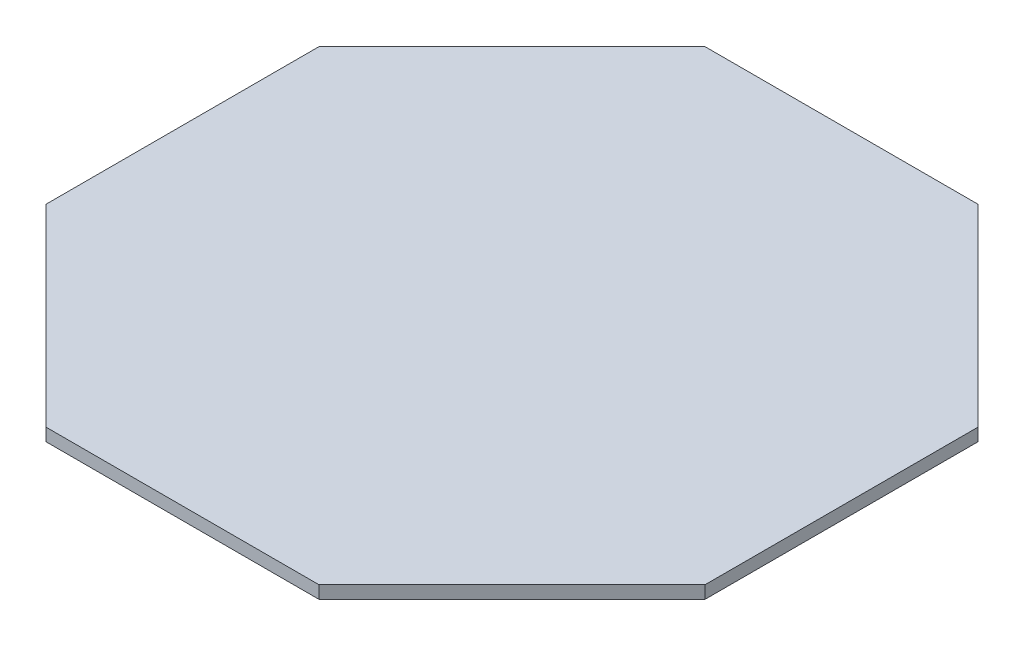
ISO-10303-21;
HEADER;
FILE_DESCRIPTION(('STEP AP214'),'2;1');
FILE_NAME('part.step','',(''),(''),'','','');
FILE_SCHEMA(('AUTOMOTIVE_DESIGN { 1 0 10303 214 1 1 1 1 }'));
ENDSEC;
DATA;
#1=APPLICATION_CONTEXT('core data for automotive mechanical design processes');
#2=APPLICATION_PROTOCOL_DEFINITION('international standard','automotive_design',2000,#1);
#3=PRODUCT_CONTEXT('',#1,'mechanical');
#4=PRODUCT('Part','Part','',(#3));
#5=PRODUCT_RELATED_PRODUCT_CATEGORY('part','',(#4));
#6=PRODUCT_DEFINITION_FORMATION('','',#4);
#7=PRODUCT_DEFINITION_CONTEXT('part definition',#1,'design');
#8=PRODUCT_DEFINITION('design','',#6,#7);
#9=PRODUCT_DEFINITION_SHAPE('','',#8);
#10=(LENGTH_UNIT() NAMED_UNIT(*) SI_UNIT(.MILLI.,.METRE.));
#11=(NAMED_UNIT(*) PLANE_ANGLE_UNIT() SI_UNIT($,.RADIAN.));
#12=(NAMED_UNIT(*) SI_UNIT($,.STERADIAN.) SOLID_ANGLE_UNIT());
#13=UNCERTAINTY_MEASURE_WITH_UNIT(LENGTH_MEASURE(1.E-05),#10,'distance_accuracy_value','');
#14=(GEOMETRIC_REPRESENTATION_CONTEXT(3) GLOBAL_UNCERTAINTY_ASSIGNED_CONTEXT((#13)) GLOBAL_UNIT_ASSIGNED_CONTEXT((#10,
#11,#12)) REPRESENTATION_CONTEXT('',''));
#15=CARTESIAN_POINT('',(0.,0.,0.));
#16=DIRECTION('',(0.,0.,1.));
#17=DIRECTION('',(1.,0.,0.));
#18=AXIS2_PLACEMENT_3D('',#15,#16,#17);
#19=CARTESIAN_POINT('',(78.0000000000003,-3.,32.3086578651015));
#20=DIRECTION('',(1.,0.,0.));
#21=DIRECTION('',(0.,0.,-1.));
#22=AXIS2_PLACEMENT_3D('',#19,#20,#21);
#23=PLANE('',#22);
#24=DIRECTION('',(0.,0.,-1.));
#25=VECTOR('',#24,1.);
#26=CARTESIAN_POINT('',(78.0000000000003,0.,32.3086578651015));
#27=LINE('',#26,#25);
#28=CARTESIAN_POINT('',(78.0000000000003,0.,32.3086578651015));
#29=VERTEX_POINT('',#28);
#30=CARTESIAN_POINT('',(78.0000000000003,0.,-32.3086578651015));
#31=VERTEX_POINT('',#30);
#32=EDGE_CURVE('E129',#29,#31,#27,.T.);
#33=ORIENTED_EDGE('',*,*,#32,.F.);
#34=DIRECTION('',(0.,1.,0.));
#35=VECTOR('',#34,1.);
#36=CARTESIAN_POINT('',(78.0000000000003,-3.,32.3086578651015));
#37=LINE('',#36,#35);
#38=CARTESIAN_POINT('',(78.0000000000003,-3.,32.3086578651015));
#39=VERTEX_POINT('',#38);
#40=EDGE_CURVE('E11',#39,#29,#37,.T.);
#41=ORIENTED_EDGE('',*,*,#40,.F.);
#42=DIRECTION('',(0.,0.,-1.));
#43=VECTOR('',#42,1.);
#44=CARTESIAN_POINT('',(78.0000000000003,-3.,32.3086578651015));
#45=LINE('',#44,#43);
#46=CARTESIAN_POINT('',(78.0000000000003,-3.,-32.3086578651015));
#47=VERTEX_POINT('',#46);
#48=EDGE_CURVE('E149',#39,#47,#45,.T.);
#49=ORIENTED_EDGE('',*,*,#48,.T.);
#50=DIRECTION('',(0.,1.,0.));
#51=VECTOR('',#50,1.);
#52=CARTESIAN_POINT('',(78.0000000000003,-3.,-32.3086578651015));
#53=LINE('',#52,#51);
#54=EDGE_CURVE('E35',#47,#31,#53,.T.);
#55=ORIENTED_EDGE('',*,*,#54,.T.);
#56=EDGE_LOOP('',(#33,#41,#49,#55));
#57=FACE_BOUND('',#56,.T.);
#58=ADVANCED_FACE('F32',(#57),#23,.T.);
#59=CARTESIAN_POINT('',(32.3086578651015,-3.,78.0000000000003));
#60=DIRECTION('',(0.707106781186547,0.,0.707106781186547));
#61=DIRECTION('',(0.707106781186548,0.,-0.707106781186548));
#62=AXIS2_PLACEMENT_3D('',#59,#60,#61);
#63=PLANE('',#62);
#64=DIRECTION('',(0.707106781186548,0.,-0.707106781186548));
#65=VECTOR('',#64,1.);
#66=CARTESIAN_POINT('',(32.3086578651015,0.,78.0000000000003));
#67=LINE('',#66,#65);
#68=CARTESIAN_POINT('',(32.3086578651015,0.,78.0000000000003));
#69=VERTEX_POINT('',#68);
#70=EDGE_CURVE('E147',#69,#29,#67,.T.);
#71=ORIENTED_EDGE('',*,*,#70,.F.);
#72=DIRECTION('',(0.,1.,0.));
#73=VECTOR('',#72,1.);
#74=CARTESIAN_POINT('',(32.3086578651015,-3.,78.0000000000003));
#75=LINE('',#74,#73);
#76=CARTESIAN_POINT('',(32.3086578651015,-3.,78.0000000000003));
#77=VERTEX_POINT('',#76);
#78=EDGE_CURVE('E41',#77,#69,#75,.T.);
#79=ORIENTED_EDGE('',*,*,#78,.F.);
#80=DIRECTION('',(0.707106781186548,0.,-0.707106781186548));
#81=VECTOR('',#80,1.);
#82=CARTESIAN_POINT('',(32.3086578651015,-3.,78.0000000000003));
#83=LINE('',#82,#81);
#84=EDGE_CURVE('E119',#77,#39,#83,.T.);
#85=ORIENTED_EDGE('',*,*,#84,.T.);
#86=ORIENTED_EDGE('',*,*,#40,.T.);
#87=EDGE_LOOP('',(#71,#79,#85,#86));
#88=FACE_BOUND('',#87,.T.);
#89=ADVANCED_FACE('F161',(#88),#63,.T.);
#90=CARTESIAN_POINT('',(-32.3086578651015,-3.,78.0000000000003));
#91=DIRECTION('',(0.,0.,1.));
#92=DIRECTION('',(1.,0.,0.));
#93=AXIS2_PLACEMENT_3D('',#90,#91,#92);
#94=PLANE('',#93);
#95=DIRECTION('',(1.,0.,0.));
#96=VECTOR('',#95,1.);
#97=CARTESIAN_POINT('',(-32.3086578651015,0.,78.0000000000003));
#98=LINE('',#97,#96);
#99=CARTESIAN_POINT('',(-32.3086578651015,0.,78.0000000000003));
#100=VERTEX_POINT('',#99);
#101=EDGE_CURVE('E106',#100,#69,#98,.T.);
#102=ORIENTED_EDGE('',*,*,#101,.F.);
#103=DIRECTION('',(0.,1.,0.));
#104=VECTOR('',#103,1.);
#105=CARTESIAN_POINT('',(-32.3086578651015,-3.,78.0000000000003));
#106=LINE('',#105,#104);
#107=CARTESIAN_POINT('',(-32.3086578651015,-3.,78.0000000000003));
#108=VERTEX_POINT('',#107);
#109=EDGE_CURVE('E101',#108,#100,#106,.T.);
#110=ORIENTED_EDGE('',*,*,#109,.F.);
#111=DIRECTION('',(1.,0.,0.));
#112=VECTOR('',#111,1.);
#113=CARTESIAN_POINT('',(-32.3086578651015,-3.,78.0000000000003));
#114=LINE('',#113,#112);
#115=EDGE_CURVE('E104',#108,#77,#114,.T.);
#116=ORIENTED_EDGE('',*,*,#115,.T.);
#117=ORIENTED_EDGE('',*,*,#78,.T.);
#118=EDGE_LOOP('',(#102,#110,#116,#117));
#119=FACE_BOUND('',#118,.T.);
#120=ADVANCED_FACE('F103',(#119),#94,.T.);
#121=CARTESIAN_POINT('',(-78.0000000000003,-3.,32.3086578651015));
#122=DIRECTION('',(-0.707106781186547,0.,0.707106781186548));
#123=DIRECTION('',(0.707106781186548,0.,0.707106781186547));
#124=AXIS2_PLACEMENT_3D('',#121,#122,#123);
#125=PLANE('',#124);
#126=DIRECTION('',(0.707106781186548,0.,0.707106781186548));
#127=VECTOR('',#126,1.);
#128=CARTESIAN_POINT('',(-78.0000000000003,0.,32.3086578651015));
#129=LINE('',#128,#127);
#130=CARTESIAN_POINT('',(-78.0000000000003,0.,32.3086578651015));
#131=VERTEX_POINT('',#130);
#132=EDGE_CURVE('E144',#131,#100,#129,.T.);
#133=ORIENTED_EDGE('',*,*,#132,.F.);
#134=DIRECTION('',(0.,1.,0.));
#135=VECTOR('',#134,1.);
#136=CARTESIAN_POINT('',(-78.0000000000003,-3.,32.3086578651015));
#137=LINE('',#136,#135);
#138=CARTESIAN_POINT('',(-78.0000000000003,-3.,32.3086578651015));
#139=VERTEX_POINT('',#138);
#140=EDGE_CURVE('E111',#139,#131,#137,.T.);
#141=ORIENTED_EDGE('',*,*,#140,.F.);
#142=DIRECTION('',(0.707106781186548,0.,0.707106781186548));
#143=VECTOR('',#142,1.);
#144=CARTESIAN_POINT('',(-78.0000000000003,-3.,32.3086578651015));
#145=LINE('',#144,#143);
#146=EDGE_CURVE('E117',#139,#108,#145,.T.);
#147=ORIENTED_EDGE('',*,*,#146,.T.);
#148=ORIENTED_EDGE('',*,*,#109,.T.);
#149=EDGE_LOOP('',(#133,#141,#147,#148));
#150=FACE_BOUND('',#149,.T.);
#151=ADVANCED_FACE('F121',(#150),#125,.T.);
#152=CARTESIAN_POINT('',(-78.0000000000003,-3.,-32.3086578651015));
#153=DIRECTION('',(-1.,0.,0.));
#154=DIRECTION('',(0.,0.,1.));
#155=AXIS2_PLACEMENT_3D('',#152,#153,#154);
#156=PLANE('',#155);
#157=DIRECTION('',(0.,0.,1.));
#158=VECTOR('',#157,1.);
#159=CARTESIAN_POINT('',(-78.0000000000003,0.,-32.3086578651015));
#160=LINE('',#159,#158);
#161=CARTESIAN_POINT('',(-78.0000000000003,0.,-32.3086578651015));
#162=VERTEX_POINT('',#161);
#163=EDGE_CURVE('E141',#162,#131,#160,.T.);
#164=ORIENTED_EDGE('',*,*,#163,.F.);
#165=DIRECTION('',(0.,1.,0.));
#166=VECTOR('',#165,1.);
#167=CARTESIAN_POINT('',(-78.0000000000003,-3.,-32.3086578651015));
#168=LINE('',#167,#166);
#169=CARTESIAN_POINT('',(-78.0000000000003,-3.,-32.3086578651015));
#170=VERTEX_POINT('',#169);
#171=EDGE_CURVE('E153',#170,#162,#168,.T.);
#172=ORIENTED_EDGE('',*,*,#171,.F.);
#173=DIRECTION('',(0.,0.,1.));
#174=VECTOR('',#173,1.);
#175=CARTESIAN_POINT('',(-78.0000000000003,-3.,-32.3086578651015));
#176=LINE('',#175,#174);
#177=EDGE_CURVE('E122',#170,#139,#176,.T.);
#178=ORIENTED_EDGE('',*,*,#177,.T.);
#179=ORIENTED_EDGE('',*,*,#140,.T.);
#180=EDGE_LOOP('',(#164,#172,#178,#179));
#181=FACE_BOUND('',#180,.T.);
#182=ADVANCED_FACE('F174',(#181),#156,.T.);
#183=CARTESIAN_POINT('',(-32.3086578651015,-3.,-78.0000000000003));
#184=DIRECTION('',(-0.707106781186548,0.,-0.707106781186547));
#185=DIRECTION('',(-0.707106781186547,0.,0.707106781186548));
#186=AXIS2_PLACEMENT_3D('',#183,#184,#185);
#187=PLANE('',#186);
#188=DIRECTION('',(-0.707106781186547,0.,0.707106781186548));
#189=VECTOR('',#188,1.);
#190=CARTESIAN_POINT('',(-32.3086578651015,0.,-78.0000000000003));
#191=LINE('',#190,#189);
#192=CARTESIAN_POINT('',(-32.3086578651015,0.,-78.0000000000003));
#193=VERTEX_POINT('',#192);
#194=EDGE_CURVE('E138',#193,#162,#191,.T.);
#195=ORIENTED_EDGE('',*,*,#194,.F.);
#196=DIRECTION('',(0.,1.,0.));
#197=VECTOR('',#196,1.);
#198=CARTESIAN_POINT('',(-32.3086578651015,-3.,-78.0000000000003));
#199=LINE('',#198,#197);
#200=CARTESIAN_POINT('',(-32.3086578651015,-3.,-78.0000000000003));
#201=VERTEX_POINT('',#200);
#202=EDGE_CURVE('E155',#201,#193,#199,.T.);
#203=ORIENTED_EDGE('',*,*,#202,.F.);
#204=DIRECTION('',(-0.707106781186547,0.,0.707106781186548));
#205=VECTOR('',#204,1.);
#206=CARTESIAN_POINT('',(-32.3086578651015,-3.,-78.0000000000003));
#207=LINE('',#206,#205);
#208=EDGE_CURVE('E124',#201,#170,#207,.T.);
#209=ORIENTED_EDGE('',*,*,#208,.T.);
#210=ORIENTED_EDGE('',*,*,#171,.T.);
#211=EDGE_LOOP('',(#195,#203,#209,#210));
#212=FACE_BOUND('',#211,.T.);
#213=ADVANCED_FACE('F177',(#212),#187,.T.);
#214=CARTESIAN_POINT('',(32.3086578651015,-3.,-78.0000000000003));
#215=DIRECTION('',(0.,0.,-1.));
#216=DIRECTION('',(-1.,0.,0.));
#217=AXIS2_PLACEMENT_3D('',#214,#215,#216);
#218=PLANE('',#217);
#219=DIRECTION('',(-1.,0.,0.));
#220=VECTOR('',#219,1.);
#221=CARTESIAN_POINT('',(32.3086578651015,0.,-78.0000000000003));
#222=LINE('',#221,#220);
#223=CARTESIAN_POINT('',(32.3086578651015,0.,-78.0000000000003));
#224=VERTEX_POINT('',#223);
#225=EDGE_CURVE('E135',#224,#193,#222,.T.);
#226=ORIENTED_EDGE('',*,*,#225,.F.);
#227=DIRECTION('',(0.,1.,0.));
#228=VECTOR('',#227,1.);
#229=CARTESIAN_POINT('',(32.3086578651015,-3.,-78.0000000000003));
#230=LINE('',#229,#228);
#231=CARTESIAN_POINT('',(32.3086578651015,-3.,-78.0000000000003));
#232=VERTEX_POINT('',#231);
#233=EDGE_CURVE('E156',#232,#224,#230,.T.);
#234=ORIENTED_EDGE('',*,*,#233,.F.);
#235=DIRECTION('',(-1.,0.,0.));
#236=VECTOR('',#235,1.);
#237=CARTESIAN_POINT('',(32.3086578651015,-3.,-78.0000000000003));
#238=LINE('',#237,#236);
#239=EDGE_CURVE('E252',#232,#201,#238,.T.);
#240=ORIENTED_EDGE('',*,*,#239,.T.);
#241=ORIENTED_EDGE('',*,*,#202,.T.);
#242=EDGE_LOOP('',(#226,#234,#240,#241));
#243=FACE_BOUND('',#242,.T.);
#244=ADVANCED_FACE('F181',(#243),#218,.T.);
#245=CARTESIAN_POINT('',(78.0000000000003,-3.,-32.3086578651015));
#246=DIRECTION('',(0.707106781186547,0.,-0.707106781186548));
#247=DIRECTION('',(-0.707106781186548,0.,-0.707106781186547));
#248=AXIS2_PLACEMENT_3D('',#245,#246,#247);
#249=PLANE('',#248);
#250=DIRECTION('',(-0.707106781186548,0.,-0.707106781186547));
#251=VECTOR('',#250,1.);
#252=CARTESIAN_POINT('',(78.0000000000003,0.,-32.3086578651015));
#253=LINE('',#252,#251);
#254=EDGE_CURVE('E132',#31,#224,#253,.T.);
#255=ORIENTED_EDGE('',*,*,#254,.F.);
#256=ORIENTED_EDGE('',*,*,#54,.F.);
#257=DIRECTION('',(-0.707106781186548,0.,-0.707106781186547));
#258=VECTOR('',#257,1.);
#259=CARTESIAN_POINT('',(78.0000000000003,-3.,-32.3086578651015));
#260=LINE('',#259,#258);
#261=EDGE_CURVE('E253',#47,#232,#260,.T.);
#262=ORIENTED_EDGE('',*,*,#261,.T.);
#263=ORIENTED_EDGE('',*,*,#233,.T.);
#264=EDGE_LOOP('',(#255,#256,#262,#263));
#265=FACE_BOUND('',#264,.T.);
#266=ADVANCED_FACE('F158',(#265),#249,.T.);
#267=CARTESIAN_POINT('',(0.,-3.,0.));
#268=DIRECTION('',(0.,1.,0.));
#269=DIRECTION('',(0.,0.,1.));
#270=AXIS2_PLACEMENT_3D('',#267,#268,#269);
#271=PLANE('',#270);
#272=ORIENTED_EDGE('',*,*,#48,.F.);
#273=ORIENTED_EDGE('',*,*,#84,.F.);
#274=ORIENTED_EDGE('',*,*,#115,.F.);
#275=ORIENTED_EDGE('',*,*,#146,.F.);
#276=ORIENTED_EDGE('',*,*,#177,.F.);
#277=ORIENTED_EDGE('',*,*,#208,.F.);
#278=ORIENTED_EDGE('',*,*,#239,.F.);
#279=ORIENTED_EDGE('',*,*,#261,.F.);
#280=EDGE_LOOP('',(#272,#273,#274,#275,#276,#277,#278,#279));
#281=FACE_BOUND('',#280,.T.);
#282=ADVANCED_FACE('F115',(#281),#271,.F.);
#283=CARTESIAN_POINT('',(0.,0.,0.));
#284=DIRECTION('',(0.,1.,0.));
#285=DIRECTION('',(0.,0.,1.));
#286=AXIS2_PLACEMENT_3D('',#283,#284,#285);
#287=PLANE('',#286);
#288=ORIENTED_EDGE('',*,*,#32,.T.);
#289=ORIENTED_EDGE('',*,*,#254,.T.);
#290=ORIENTED_EDGE('',*,*,#225,.T.);
#291=ORIENTED_EDGE('',*,*,#194,.T.);
#292=ORIENTED_EDGE('',*,*,#163,.T.);
#293=ORIENTED_EDGE('',*,*,#132,.T.);
#294=ORIENTED_EDGE('',*,*,#101,.T.);
#295=ORIENTED_EDGE('',*,*,#70,.T.);
#296=EDGE_LOOP('',(#288,#289,#290,#291,#292,#293,#294,#295));
#297=FACE_BOUND('',#296,.T.);
#298=ADVANCED_FACE('F160',(#297),#287,.T.);
#299=CLOSED_SHELL('',(#58,#89,#120,#151,#182,#213,#244,#266,#282,#298));
#300=MANIFOLD_SOLID_BREP('B2',#299);
#301=ADVANCED_BREP_SHAPE_REPRESENTATION('',(#18,#300),#14);
#302=SHAPE_DEFINITION_REPRESENTATION(#9,#301);
ENDSEC;
END-ISO-10303-21;
